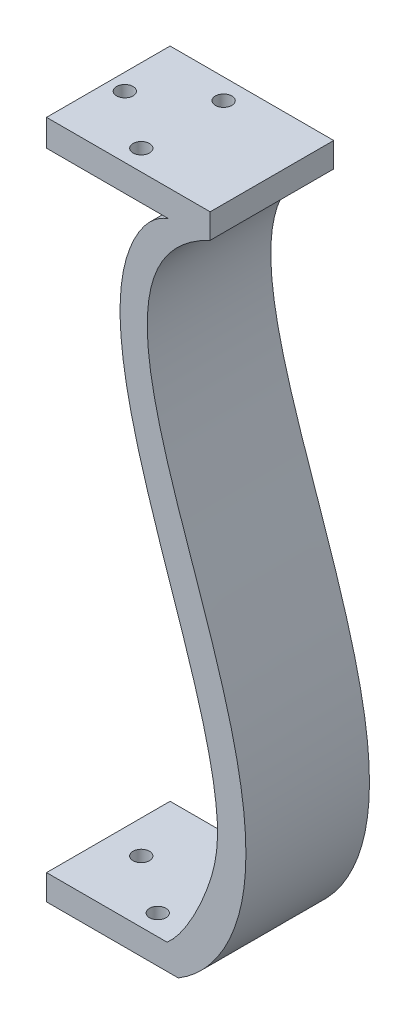
ISO-10303-21;
HEADER;
FILE_DESCRIPTION(('STEP AP214'),'2;1');
FILE_NAME('part.step','',(''),(''),'','','');
FILE_SCHEMA(('AUTOMOTIVE_DESIGN { 1 0 10303 214 1 1 1 1 }'));
ENDSEC;
DATA;
#1=APPLICATION_CONTEXT('core data for automotive mechanical design processes');
#2=APPLICATION_PROTOCOL_DEFINITION('international standard','automotive_design',2000,#1);
#3=PRODUCT_CONTEXT('',#1,'mechanical');
#4=PRODUCT('Part','Part','',(#3));
#5=PRODUCT_RELATED_PRODUCT_CATEGORY('part','',(#4));
#6=PRODUCT_DEFINITION_FORMATION('','',#4);
#7=PRODUCT_DEFINITION_CONTEXT('part definition',#1,'design');
#8=PRODUCT_DEFINITION('design','',#6,#7);
#9=PRODUCT_DEFINITION_SHAPE('','',#8);
#10=(LENGTH_UNIT() NAMED_UNIT(*) SI_UNIT(.MILLI.,.METRE.));
#11=(NAMED_UNIT(*) PLANE_ANGLE_UNIT() SI_UNIT($,.RADIAN.));
#12=(NAMED_UNIT(*) SI_UNIT($,.STERADIAN.) SOLID_ANGLE_UNIT());
#13=UNCERTAINTY_MEASURE_WITH_UNIT(LENGTH_MEASURE(1.E-05),#10,'distance_accuracy_value','');
#14=(GEOMETRIC_REPRESENTATION_CONTEXT(3) GLOBAL_UNCERTAINTY_ASSIGNED_CONTEXT((#13)) GLOBAL_UNIT_ASSIGNED_CONTEXT((#10,
#11,#12)) REPRESENTATION_CONTEXT('',''));
#15=CARTESIAN_POINT('',(0.,0.,0.));
#16=DIRECTION('',(0.,0.,1.));
#17=DIRECTION('',(1.,0.,0.));
#18=AXIS2_PLACEMENT_3D('',#15,#16,#17);
#19=CARTESIAN_POINT('',(0.,165.,-30.));
#20=DIRECTION('',(0.,0.,1.));
#21=DIRECTION('',(1.,0.,0.));
#22=AXIS2_PLACEMENT_3D('',#19,#20,#21);
#23=PLANE('',#22);
#24=DIRECTION('',(-1.,0.,0.));
#25=VECTOR('',#24,1.);
#26=CARTESIAN_POINT('',(0.,6.16560213056344,-30.));
#27=LINE('',#26,#25);
#28=CARTESIAN_POINT('',(-20.7198654493493,6.16560213056345,-30.));
#29=VERTEX_POINT('',#28);
#30=CARTESIAN_POINT('',(-50.,6.16560213056344,-30.));
#31=VERTEX_POINT('',#30);
#32=EDGE_CURVE('E59',#29,#31,#27,.T.);
#33=ORIENTED_EDGE('',*,*,#32,.F.);
#34=CARTESIAN_POINT('',(-20.7198654493493,6.16560213056345,-30.));
#35=CARTESIAN_POINT('',(-16.4171086317866,9.87986086313503,-30.));
#36=CARTESIAN_POINT('',(-8.59455584063185,25.2925313476993,-30.));
#37=CARTESIAN_POINT('',(-7.12445917762197,64.8232239319523,-30.));
#38=CARTESIAN_POINT('',(-46.2843782530998,128.92439955058,-30.));
#39=CARTESIAN_POINT('',(-24.2819890563055,157.156211749063,-30.));
#40=CARTESIAN_POINT('',(-20.3559258397296,158.5,-30.));
#41=B_SPLINE_CURVE_WITH_KNOTS('',3,(#34,#35,#36,#37,#38,#39,#40),.UNSPECIFIED.,.F.,.F.,(4,1,1,1,
4),(0.0525728869515312,0.159086781003664,0.252212072365428,0.902535386324314,1.),.UNSPECIFIED.);
#42=CARTESIAN_POINT('',(-20.3559258397296,158.5,-30.));
#43=VERTEX_POINT('',#42);
#44=EDGE_CURVE('E63',#43,#29,#41,.F.);
#45=ORIENTED_EDGE('',*,*,#44,.F.);
#46=DIRECTION('',(1.,0.,0.));
#47=VECTOR('',#46,1.);
#48=CARTESIAN_POINT('',(0.,158.5,-30.));
#49=LINE('',#48,#47);
#50=CARTESIAN_POINT('',(-50.,158.5,-30.));
#51=VERTEX_POINT('',#50);
#52=EDGE_CURVE('E221',#51,#43,#49,.T.);
#53=ORIENTED_EDGE('',*,*,#52,.F.);
#54=DIRECTION('',(0.,-1.,0.));
#55=VECTOR('',#54,1.);
#56=CARTESIAN_POINT('',(-50.,165.,-30.));
#57=LINE('',#56,#55);
#58=CARTESIAN_POINT('',(-50.,165.,-30.));
#59=VERTEX_POINT('',#58);
#60=EDGE_CURVE('E133',#59,#51,#57,.T.);
#61=ORIENTED_EDGE('',*,*,#60,.F.);
#62=DIRECTION('',(-1.,0.,0.));
#63=VECTOR('',#62,1.);
#64=CARTESIAN_POINT('',(0.,165.,-30.));
#65=LINE('',#64,#63);
#66=CARTESIAN_POINT('',(-10.2669307677797,165.,-30.));
#67=VERTEX_POINT('',#66);
#68=EDGE_CURVE('E152',#67,#59,#65,.T.);
#69=ORIENTED_EDGE('',*,*,#68,.F.);
#70=DIRECTION('',(0.,-1.,0.));
#71=VECTOR('',#70,1.);
#72=CARTESIAN_POINT('',(-10.2669307677797,159.,-30.));
#73=LINE('',#72,#71);
#74=CARTESIAN_POINT('',(-10.2669307677797,159.,-30.));
#75=VERTEX_POINT('',#74);
#76=EDGE_CURVE('E168',#67,#75,#73,.T.);
#77=ORIENTED_EDGE('',*,*,#76,.T.);
#78=CARTESIAN_POINT('',(-10.2669307677797,159.,-30.));
#79=CARTESIAN_POINT('',(-53.3339106429098,138.279185217186,-30.));
#80=CARTESIAN_POINT('',(21.0968658973275,53.2888857987779,-30.));
#81=CARTESIAN_POINT('',(-10.655091279707,4.4325375057349,-30.));
#82=CARTESIAN_POINT('',(-18.,0.,-30.));
#83=B_SPLINE_CURVE_WITH_KNOTS('',3,(#78,#79,#80,#81,#82),.UNSPECIFIED.,.F.,.F.,(4,1,4),(0.,
0.846823903806327,1.),.UNSPECIFIED.);
#84=CARTESIAN_POINT('',(-18.,0.,-30.));
#85=VERTEX_POINT('',#84);
#86=EDGE_CURVE('E174',#75,#85,#83,.T.);
#87=ORIENTED_EDGE('',*,*,#86,.T.);
#88=DIRECTION('',(-1.,0.,0.));
#89=VECTOR('',#88,1.);
#90=CARTESIAN_POINT('',(0.,0.,-30.));
#91=LINE('',#90,#89);
#92=CARTESIAN_POINT('',(-50.,0.,-30.));
#93=VERTEX_POINT('',#92);
#94=EDGE_CURVE('E156',#85,#93,#91,.T.);
#95=ORIENTED_EDGE('',*,*,#94,.T.);
#96=EDGE_CURVE('E125',#31,#93,#57,.T.);
#97=ORIENTED_EDGE('',*,*,#96,.F.);
#98=EDGE_LOOP('',(#33,#45,#53,#61,#69,#77,#87,#95,#97));
#99=FACE_BOUND('',#98,.T.);
#100=ADVANCED_FACE('F45',(#99),#23,.F.);
#101=CARTESIAN_POINT('',(-50.,165.,0.));
#102=DIRECTION('',(1.,0.,0.));
#103=DIRECTION('',(0.,0.,-1.));
#104=AXIS2_PLACEMENT_3D('',#101,#102,#103);
#105=PLANE('',#104);
#106=DIRECTION('',(0.,0.,-1.));
#107=VECTOR('',#106,1.);
#108=CARTESIAN_POINT('',(-50.,6.16560213056344,257.402973582958));
#109=LINE('',#108,#107);
#110=CARTESIAN_POINT('',(-50.,6.16560213056344,0.));
#111=VERTEX_POINT('',#110);
#112=EDGE_CURVE('E219',#111,#31,#109,.T.);
#113=ORIENTED_EDGE('',*,*,#112,.T.);
#114=ORIENTED_EDGE('',*,*,#96,.T.);
#115=DIRECTION('',(0.,0.,1.));
#116=VECTOR('',#115,1.);
#117=CARTESIAN_POINT('',(-50.,0.,0.));
#118=LINE('',#117,#116);
#119=CARTESIAN_POINT('',(-50.,0.,0.));
#120=VERTEX_POINT('',#119);
#121=EDGE_CURVE('E153',#93,#120,#118,.T.);
#122=ORIENTED_EDGE('',*,*,#121,.T.);
#123=DIRECTION('',(0.,-1.,0.));
#124=VECTOR('',#123,1.);
#125=CARTESIAN_POINT('',(-50.,165.,0.));
#126=LINE('',#125,#124);
#127=EDGE_CURVE('E126',#111,#120,#126,.T.);
#128=ORIENTED_EDGE('',*,*,#127,.F.);
#129=EDGE_LOOP('',(#113,#114,#122,#128));
#130=FACE_BOUND('',#129,.T.);
#131=ADVANCED_FACE('F210',(#130),#105,.F.);
#132=DIRECTION('',(0.,0.,-1.));
#133=VECTOR('',#132,1.);
#134=CARTESIAN_POINT('',(-50.,158.5,257.402973582958));
#135=LINE('',#134,#133);
#136=CARTESIAN_POINT('',(-50.,158.5,0.));
#137=VERTEX_POINT('',#136);
#138=EDGE_CURVE('E130',#137,#51,#135,.T.);
#139=ORIENTED_EDGE('',*,*,#138,.F.);
#140=CARTESIAN_POINT('',(-50.,165.,0.));
#141=VERTEX_POINT('',#140);
#142=EDGE_CURVE('E114',#141,#137,#126,.T.);
#143=ORIENTED_EDGE('',*,*,#142,.F.);
#144=DIRECTION('',(0.,0.,1.));
#145=VECTOR('',#144,1.);
#146=CARTESIAN_POINT('',(-50.,165.,0.));
#147=LINE('',#146,#145);
#148=EDGE_CURVE('E161',#59,#141,#147,.T.);
#149=ORIENTED_EDGE('',*,*,#148,.F.);
#150=ORIENTED_EDGE('',*,*,#60,.T.);
#151=EDGE_LOOP('',(#139,#143,#149,#150));
#152=FACE_BOUND('',#151,.T.);
#153=ADVANCED_FACE('F131',(#152),#105,.F.);
#154=CARTESIAN_POINT('',(0.,165.,0.));
#155=DIRECTION('',(0.,0.,-1.));
#156=DIRECTION('',(-1.,0.,0.));
#157=AXIS2_PLACEMENT_3D('',#154,#155,#156);
#158=PLANE('',#157);
#159=DIRECTION('',(1.,0.,0.));
#160=VECTOR('',#159,1.);
#161=CARTESIAN_POINT('',(0.,6.16560213056344,0.));
#162=LINE('',#161,#160);
#163=CARTESIAN_POINT('',(-20.7198654493493,6.16560213056345,0.));
#164=VERTEX_POINT('',#163);
#165=EDGE_CURVE('E13',#111,#164,#162,.T.);
#166=ORIENTED_EDGE('',*,*,#165,.F.);
#167=ORIENTED_EDGE('',*,*,#127,.T.);
#168=DIRECTION('',(1.,0.,0.));
#169=VECTOR('',#168,1.);
#170=CARTESIAN_POINT('',(0.,0.,0.));
#171=LINE('',#170,#169);
#172=CARTESIAN_POINT('',(-18.,0.,0.));
#173=VERTEX_POINT('',#172);
#174=EDGE_CURVE('E149',#120,#173,#171,.T.);
#175=ORIENTED_EDGE('',*,*,#174,.T.);
#176=CARTESIAN_POINT('',(-10.2669307677797,159.,0.));
#177=CARTESIAN_POINT('',(-53.3339106429098,138.279185217186,0.));
#178=CARTESIAN_POINT('',(21.0968658973275,53.2888857987779,0.));
#179=CARTESIAN_POINT('',(-10.655091279707,4.4325375057349,0.));
#180=CARTESIAN_POINT('',(-18.,0.,0.));
#181=B_SPLINE_CURVE_WITH_KNOTS('',3,(#176,#177,#178,#179,#180),.UNSPECIFIED.,.F.,.F.,(4,1,4),
(0.,0.846823903806327,1.),.UNSPECIFIED.);
#182=CARTESIAN_POINT('',(-10.2669307677797,159.,0.));
#183=VERTEX_POINT('',#182);
#184=EDGE_CURVE('E175',#183,#173,#181,.T.);
#185=ORIENTED_EDGE('',*,*,#184,.F.);
#186=DIRECTION('',(0.,-1.,0.));
#187=VECTOR('',#186,1.);
#188=CARTESIAN_POINT('',(-10.2669307677797,159.,0.));
#189=LINE('',#188,#187);
#190=CARTESIAN_POINT('',(-10.2669307677797,165.,0.));
#191=VERTEX_POINT('',#190);
#192=EDGE_CURVE('E171',#191,#183,#189,.T.);
#193=ORIENTED_EDGE('',*,*,#192,.F.);
#194=DIRECTION('',(1.,0.,0.));
#195=VECTOR('',#194,1.);
#196=CARTESIAN_POINT('',(0.,165.,0.));
#197=LINE('',#196,#195);
#198=EDGE_CURVE('E122',#141,#191,#197,.T.);
#199=ORIENTED_EDGE('',*,*,#198,.F.);
#200=ORIENTED_EDGE('',*,*,#142,.T.);
#201=DIRECTION('',(-1.,0.,0.));
#202=VECTOR('',#201,1.);
#203=CARTESIAN_POINT('',(0.,158.5,0.));
#204=LINE('',#203,#202);
#205=CARTESIAN_POINT('',(-20.3559258397296,158.5,0.));
#206=VERTEX_POINT('',#205);
#207=EDGE_CURVE('E118',#206,#137,#204,.T.);
#208=ORIENTED_EDGE('',*,*,#207,.F.);
#209=CARTESIAN_POINT('',(-20.7198654493493,6.16560213056345,0.));
#210=CARTESIAN_POINT('',(-16.4171086317866,9.87986086313503,0.));
#211=CARTESIAN_POINT('',(-8.59455584063185,25.2925313476993,0.));
#212=CARTESIAN_POINT('',(-7.12445917762197,64.8232239319523,0.));
#213=CARTESIAN_POINT('',(-46.2843782530998,128.92439955058,0.));
#214=CARTESIAN_POINT('',(-24.2819890563055,157.156211749063,0.));
#215=CARTESIAN_POINT('',(-20.3559258397296,158.5,0.));
#216=B_SPLINE_CURVE_WITH_KNOTS('',3,(#209,#210,#211,#212,#213,#214,#215),.UNSPECIFIED.,.F.,.F.,
(4,1,1,1,4),(0.0525728869515312,0.159086781003664,0.252212072365428,0.902535386324314,1.),.UNSPECIFIED.);
#217=EDGE_CURVE('E52',#164,#206,#216,.T.);
#218=ORIENTED_EDGE('',*,*,#217,.F.);
#219=EDGE_LOOP('',(#166,#167,#175,#185,#193,#199,#200,#208,#218));
#220=FACE_BOUND('',#219,.T.);
#221=ADVANCED_FACE('F116',(#220),#158,.F.);
#222=CARTESIAN_POINT('',(0.,165.,0.));
#223=DIRECTION('',(0.,1.,0.));
#224=DIRECTION('',(0.,0.,1.));
#225=AXIS2_PLACEMENT_3D('',#222,#223,#224);
#226=PLANE('',#225);
#227=CARTESIAN_POINT('',(-32.,165.,-4.99999999999999));
#228=DIRECTION('',(0.,1.,0.));
#229=DIRECTION('',(0.,0.,1.));
#230=AXIS2_PLACEMENT_3D('',#227,#228,#229);
#231=CIRCLE('',#230,2.);
#232=CARTESIAN_POINT('',(-32.,165.,-2.99999999999999));
#233=VERTEX_POINT('',#232);
#234=EDGE_CURVE('E293',#233,#233,#231,.T.);
#235=ORIENTED_EDGE('',*,*,#234,.F.);
#236=EDGE_LOOP('',(#235));
#237=FACE_BOUND('',#236,.T.);
#238=CARTESIAN_POINT('',(-32.,165.,-25.));
#239=DIRECTION('',(0.,1.,0.));
#240=DIRECTION('',(0.,0.,1.));
#241=AXIS2_PLACEMENT_3D('',#238,#239,#240);
#242=CIRCLE('',#241,2.);
#243=CARTESIAN_POINT('',(-32.,165.,-23.));
#244=VERTEX_POINT('',#243);
#245=EDGE_CURVE('E287',#244,#244,#242,.T.);
#246=ORIENTED_EDGE('',*,*,#245,.F.);
#247=EDGE_LOOP('',(#246));
#248=FACE_BOUND('',#247,.T.);
#249=CARTESIAN_POINT('',(-46.,165.,-15.));
#250=DIRECTION('',(0.,1.,0.));
#251=DIRECTION('',(0.,0.,1.));
#252=AXIS2_PLACEMENT_3D('',#249,#250,#251);
#253=CIRCLE('',#252,2.);
#254=CARTESIAN_POINT('',(-46.,165.,-13.));
#255=VERTEX_POINT('',#254);
#256=EDGE_CURVE('E280',#255,#255,#253,.T.);
#257=ORIENTED_EDGE('',*,*,#256,.F.);
#258=EDGE_LOOP('',(#257));
#259=FACE_BOUND('',#258,.T.);
#260=DIRECTION('',(0.,0.,1.));
#261=VECTOR('',#260,1.);
#262=CARTESIAN_POINT('',(-10.2669307677797,165.,-30.));
#263=LINE('',#262,#261);
#264=EDGE_CURVE('E167',#67,#191,#263,.T.);
#265=ORIENTED_EDGE('',*,*,#264,.F.);
#266=ORIENTED_EDGE('',*,*,#68,.T.);
#267=ORIENTED_EDGE('',*,*,#148,.T.);
#268=ORIENTED_EDGE('',*,*,#198,.T.);
#269=EDGE_LOOP('',(#265,#266,#267,#268));
#270=FACE_BOUND('',#269,.T.);
#271=ADVANCED_FACE('F202',(#237,#248,#259,#270),#226,.T.);
#272=CARTESIAN_POINT('',(0.,0.,0.));
#273=DIRECTION('',(0.,1.,0.));
#274=DIRECTION('',(0.,0.,1.));
#275=AXIS2_PLACEMENT_3D('',#272,#273,#274);
#276=PLANE('',#275);
#277=CARTESIAN_POINT('',(-28.,0.,-4.99999999999999));
#278=DIRECTION('',(0.,-1.,0.));
#279=DIRECTION('',(0.,0.,1.));
#280=AXIS2_PLACEMENT_3D('',#277,#278,#279);
#281=CIRCLE('',#280,2.);
#282=CARTESIAN_POINT('',(-28.,0.,-2.99999999999999));
#283=VERTEX_POINT('',#282);
#284=EDGE_CURVE('E276',#283,#283,#281,.T.);
#285=ORIENTED_EDGE('',*,*,#284,.F.);
#286=EDGE_LOOP('',(#285));
#287=FACE_BOUND('',#286,.T.);
#288=CARTESIAN_POINT('',(-28.,0.,-25.));
#289=DIRECTION('',(0.,-1.,0.));
#290=DIRECTION('',(0.,0.,-1.));
#291=AXIS2_PLACEMENT_3D('',#288,#289,#290);
#292=CIRCLE('',#291,2.);
#293=CARTESIAN_POINT('',(-28.,0.,-27.));
#294=VERTEX_POINT('',#293);
#295=EDGE_CURVE('E270',#294,#294,#292,.T.);
#296=ORIENTED_EDGE('',*,*,#295,.F.);
#297=EDGE_LOOP('',(#296));
#298=FACE_BOUND('',#297,.T.);
#299=CARTESIAN_POINT('',(-42.,0.,-15.));
#300=DIRECTION('',(0.,-1.,0.));
#301=DIRECTION('',(0.,0.,-1.));
#302=AXIS2_PLACEMENT_3D('',#299,#300,#301);
#303=CIRCLE('',#302,2.);
#304=CARTESIAN_POINT('',(-42.,0.,-17.));
#305=VERTEX_POINT('',#304);
#306=EDGE_CURVE('E237',#305,#305,#303,.T.);
#307=ORIENTED_EDGE('',*,*,#306,.F.);
#308=EDGE_LOOP('',(#307));
#309=FACE_BOUND('',#308,.T.);
#310=ORIENTED_EDGE('',*,*,#94,.F.);
#311=DIRECTION('',(0.,0.,1.));
#312=VECTOR('',#311,1.);
#313=CARTESIAN_POINT('',(-18.,0.,-30.));
#314=LINE('',#313,#312);
#315=EDGE_CURVE('E164',#85,#173,#314,.T.);
#316=ORIENTED_EDGE('',*,*,#315,.T.);
#317=ORIENTED_EDGE('',*,*,#174,.F.);
#318=ORIENTED_EDGE('',*,*,#121,.F.);
#319=EDGE_LOOP('',(#310,#316,#317,#318));
#320=FACE_BOUND('',#319,.T.);
#321=ADVANCED_FACE('F199',(#287,#298,#309,#320),#276,.F.);
#322=DIRECTION('',(0.,0.,1.));
#323=VECTOR('',#322,1.);
#324=SURFACE_OF_LINEAR_EXTRUSION('',#83,#323);
#325=ORIENTED_EDGE('',*,*,#184,.T.);
#326=ORIENTED_EDGE('',*,*,#315,.F.);
#327=ORIENTED_EDGE('',*,*,#86,.F.);
#328=DIRECTION('',(0.,0.,1.));
#329=VECTOR('',#328,1.);
#330=CARTESIAN_POINT('',(-10.2669307677797,159.,-30.));
#331=LINE('',#330,#329);
#332=EDGE_CURVE('E159',#75,#183,#331,.T.);
#333=ORIENTED_EDGE('',*,*,#332,.T.);
#334=EDGE_LOOP('',(#325,#326,#327,#333));
#335=FACE_BOUND('',#334,.T.);
#336=ADVANCED_FACE('F194',(#335),#324,.F.);
#337=CARTESIAN_POINT('',(-10.2669307677797,159.,-30.));
#338=DIRECTION('',(-1.,0.,0.));
#339=DIRECTION('',(0.,0.,1.));
#340=AXIS2_PLACEMENT_3D('',#337,#338,#339);
#341=PLANE('',#340);
#342=ORIENTED_EDGE('',*,*,#192,.T.);
#343=ORIENTED_EDGE('',*,*,#332,.F.);
#344=ORIENTED_EDGE('',*,*,#76,.F.);
#345=ORIENTED_EDGE('',*,*,#264,.T.);
#346=EDGE_LOOP('',(#342,#343,#344,#345));
#347=FACE_BOUND('',#346,.T.);
#348=ADVANCED_FACE('F198',(#347),#341,.F.);
#349=CARTESIAN_POINT('',(-20.7198654493493,6.16560213056345,257.402973582958));
#350=DIRECTION('',(0.,1.,0.));
#351=DIRECTION('',(-1.,0.,0.));
#352=AXIS2_PLACEMENT_3D('',#349,#350,#351);
#353=PLANE('',#352);
#354=CARTESIAN_POINT('',(-28.,6.16560213056344,-4.99999999999999));
#355=DIRECTION('',(0.,1.,0.));
#356=DIRECTION('',(-1.,0.,0.));
#357=AXIS2_PLACEMENT_3D('',#354,#355,#356);
#358=CIRCLE('',#357,2.);
#359=CARTESIAN_POINT('',(-30.,6.16560213056344,-4.99999999999999));
#360=VERTEX_POINT('',#359);
#361=EDGE_CURVE('E261',#360,#360,#358,.F.);
#362=ORIENTED_EDGE('',*,*,#361,.T.);
#363=EDGE_LOOP('',(#362));
#364=FACE_BOUND('',#363,.T.);
#365=CARTESIAN_POINT('',(-28.,6.16560213056344,-25.));
#366=DIRECTION('',(0.,1.,0.));
#367=DIRECTION('',(-1.,0.,0.));
#368=AXIS2_PLACEMENT_3D('',#365,#366,#367);
#369=CIRCLE('',#368,2.);
#370=CARTESIAN_POINT('',(-30.,6.16560213056344,-25.));
#371=VERTEX_POINT('',#370);
#372=EDGE_CURVE('E265',#371,#371,#369,.F.);
#373=ORIENTED_EDGE('',*,*,#372,.T.);
#374=EDGE_LOOP('',(#373));
#375=FACE_BOUND('',#374,.T.);
#376=CARTESIAN_POINT('',(-42.,6.16560213056344,-15.));
#377=DIRECTION('',(0.,1.,0.));
#378=DIRECTION('',(-1.,0.,0.));
#379=AXIS2_PLACEMENT_3D('',#376,#377,#378);
#380=CIRCLE('',#379,2.);
#381=CARTESIAN_POINT('',(-44.,6.16560213056344,-15.));
#382=VERTEX_POINT('',#381);
#383=EDGE_CURVE('E268',#382,#382,#380,.F.);
#384=ORIENTED_EDGE('',*,*,#383,.T.);
#385=EDGE_LOOP('',(#384));
#386=FACE_BOUND('',#385,.T.);
#387=DIRECTION('',(0.,0.,-1.));
#388=VECTOR('',#387,1.);
#389=CARTESIAN_POINT('',(-20.7198654493493,6.16560213056345,257.402973582958));
#390=LINE('',#389,#388);
#391=EDGE_CURVE('E135',#164,#29,#390,.T.);
#392=ORIENTED_EDGE('',*,*,#391,.T.);
#393=ORIENTED_EDGE('',*,*,#32,.T.);
#394=ORIENTED_EDGE('',*,*,#112,.F.);
#395=ORIENTED_EDGE('',*,*,#165,.T.);
#396=EDGE_LOOP('',(#392,#393,#394,#395));
#397=FACE_BOUND('',#396,.T.);
#398=ADVANCED_FACE('F226',(#364,#375,#386,#397),#353,.T.);
#399=CARTESIAN_POINT('',(-20.7198654493493,6.16560213056345,257.402973582958));
#400=CARTESIAN_POINT('',(-16.4171086317866,9.87986086313503,257.402973582958));
#401=CARTESIAN_POINT('',(-8.59455584063185,25.2925313476993,257.402973582958));
#402=CARTESIAN_POINT('',(-7.12445917762197,64.8232239319523,257.402973582958));
#403=CARTESIAN_POINT('',(-46.2843782530998,128.92439955058,257.402973582958));
#404=CARTESIAN_POINT('',(-24.2819890563055,157.156211749063,257.402973582958));
#405=CARTESIAN_POINT('',(-20.3559258397296,158.5,257.402973582958));
#406=B_SPLINE_CURVE_WITH_KNOTS('',3,(#399,#400,#401,#402,#403,#404,#405),.UNSPECIFIED.,.F.,.F.,
(4,1,1,1,4),(0.0525728869515312,0.159086781003664,0.252212072365428,0.902535386324314,1.),.UNSPECIFIED.);
#407=DIRECTION('',(0.,0.,-1.));
#408=VECTOR('',#407,1.);
#409=SURFACE_OF_LINEAR_EXTRUSION('',#406,#408);
#410=DIRECTION('',(0.,0.,-1.));
#411=VECTOR('',#410,1.);
#412=CARTESIAN_POINT('',(-20.3559258397296,158.5,257.402973582958));
#413=LINE('',#412,#411);
#414=EDGE_CURVE('E136',#206,#43,#413,.T.);
#415=ORIENTED_EDGE('',*,*,#414,.T.);
#416=ORIENTED_EDGE('',*,*,#44,.T.);
#417=ORIENTED_EDGE('',*,*,#391,.F.);
#418=ORIENTED_EDGE('',*,*,#217,.T.);
#419=EDGE_LOOP('',(#415,#416,#417,#418));
#420=FACE_BOUND('',#419,.T.);
#421=ADVANCED_FACE('F248',(#420),#409,.T.);
#422=CARTESIAN_POINT('',(-20.3559258397297,158.5,257.402973582958));
#423=DIRECTION('',(0.,-1.,0.));
#424=DIRECTION('',(0.,0.,-1.));
#425=AXIS2_PLACEMENT_3D('',#422,#423,#424);
#426=PLANE('',#425);
#427=CARTESIAN_POINT('',(-32.,158.5,-4.99999999999999));
#428=DIRECTION('',(0.,-1.,0.));
#429=DIRECTION('',(0.,0.,-1.));
#430=AXIS2_PLACEMENT_3D('',#427,#428,#429);
#431=CIRCLE('',#430,2.);
#432=CARTESIAN_POINT('',(-32.,158.5,-7.));
#433=VERTEX_POINT('',#432);
#434=EDGE_CURVE('E290',#433,#433,#431,.F.);
#435=ORIENTED_EDGE('',*,*,#434,.T.);
#436=EDGE_LOOP('',(#435));
#437=FACE_BOUND('',#436,.T.);
#438=CARTESIAN_POINT('',(-32.,158.5,-25.));
#439=DIRECTION('',(0.,-1.,0.));
#440=DIRECTION('',(0.,0.,-1.));
#441=AXIS2_PLACEMENT_3D('',#438,#439,#440);
#442=CIRCLE('',#441,2.);
#443=CARTESIAN_POINT('',(-32.,158.5,-27.));
#444=VERTEX_POINT('',#443);
#445=EDGE_CURVE('E284',#444,#444,#442,.F.);
#446=ORIENTED_EDGE('',*,*,#445,.T.);
#447=EDGE_LOOP('',(#446));
#448=FACE_BOUND('',#447,.T.);
#449=CARTESIAN_POINT('',(-46.,158.5,-15.));
#450=DIRECTION('',(0.,-1.,0.));
#451=DIRECTION('',(0.,0.,-1.));
#452=AXIS2_PLACEMENT_3D('',#449,#450,#451);
#453=CIRCLE('',#452,2.);
#454=CARTESIAN_POINT('',(-46.,158.5,-17.));
#455=VERTEX_POINT('',#454);
#456=EDGE_CURVE('E281',#455,#455,#453,.F.);
#457=ORIENTED_EDGE('',*,*,#456,.T.);
#458=EDGE_LOOP('',(#457));
#459=FACE_BOUND('',#458,.T.);
#460=ORIENTED_EDGE('',*,*,#138,.T.);
#461=ORIENTED_EDGE('',*,*,#52,.T.);
#462=ORIENTED_EDGE('',*,*,#414,.F.);
#463=ORIENTED_EDGE('',*,*,#207,.T.);
#464=EDGE_LOOP('',(#460,#461,#462,#463));
#465=FACE_BOUND('',#464,.T.);
#466=ADVANCED_FACE('F139',(#437,#448,#459,#465),#426,.T.);
#467=CARTESIAN_POINT('',(-42.,165.001,-15.));
#468=DIRECTION('',(0.,-1.,0.));
#469=DIRECTION('',(0.,0.,-1.));
#470=AXIS2_PLACEMENT_3D('',#467,#468,#469);
#471=CYLINDRICAL_SURFACE('',#470,2.);
#472=ORIENTED_EDGE('',*,*,#383,.F.);
#473=EDGE_LOOP('',(#472));
#474=FACE_BOUND('',#473,.T.);
#475=ORIENTED_EDGE('',*,*,#306,.T.);
#476=EDGE_LOOP('',(#475));
#477=FACE_BOUND('',#476,.T.);
#478=ADVANCED_FACE('F336',(#474,#477),#471,.F.);
#479=CARTESIAN_POINT('',(-28.,165.001,-25.));
#480=DIRECTION('',(0.,-1.,0.));
#481=DIRECTION('',(0.,0.,-1.));
#482=AXIS2_PLACEMENT_3D('',#479,#480,#481);
#483=CYLINDRICAL_SURFACE('',#482,2.);
#484=ORIENTED_EDGE('',*,*,#372,.F.);
#485=EDGE_LOOP('',(#484));
#486=FACE_BOUND('',#485,.T.);
#487=ORIENTED_EDGE('',*,*,#295,.T.);
#488=EDGE_LOOP('',(#487));
#489=FACE_BOUND('',#488,.T.);
#490=ADVANCED_FACE('F330',(#486,#489),#483,.F.);
#491=CARTESIAN_POINT('',(-28.,165.001,-4.99999999999999));
#492=DIRECTION('',(0.,-1.,0.));
#493=DIRECTION('',(0.,0.,-1.));
#494=AXIS2_PLACEMENT_3D('',#491,#492,#493);
#495=CYLINDRICAL_SURFACE('',#494,2.);
#496=ORIENTED_EDGE('',*,*,#361,.F.);
#497=EDGE_LOOP('',(#496));
#498=FACE_BOUND('',#497,.T.);
#499=ORIENTED_EDGE('',*,*,#284,.T.);
#500=EDGE_LOOP('',(#499));
#501=FACE_BOUND('',#500,.T.);
#502=ADVANCED_FACE('F321',(#498,#501),#495,.F.);
#503=CARTESIAN_POINT('',(-46.,-0.001000000000001,-15.));
#504=DIRECTION('',(0.,1.,0.));
#505=DIRECTION('',(0.,0.,1.));
#506=AXIS2_PLACEMENT_3D('',#503,#504,#505);
#507=CYLINDRICAL_SURFACE('',#506,2.);
#508=ORIENTED_EDGE('',*,*,#456,.F.);
#509=EDGE_LOOP('',(#508));
#510=FACE_BOUND('',#509,.T.);
#511=ORIENTED_EDGE('',*,*,#256,.T.);
#512=EDGE_LOOP('',(#511));
#513=FACE_BOUND('',#512,.T.);
#514=ADVANCED_FACE('F319',(#510,#513),#507,.F.);
#515=CARTESIAN_POINT('',(-32.,-0.001000000000001,-25.));
#516=DIRECTION('',(0.,1.,0.));
#517=DIRECTION('',(0.,0.,1.));
#518=AXIS2_PLACEMENT_3D('',#515,#516,#517);
#519=CYLINDRICAL_SURFACE('',#518,2.);
#520=ORIENTED_EDGE('',*,*,#445,.F.);
#521=EDGE_LOOP('',(#520));
#522=FACE_BOUND('',#521,.T.);
#523=ORIENTED_EDGE('',*,*,#245,.T.);
#524=EDGE_LOOP('',(#523));
#525=FACE_BOUND('',#524,.T.);
#526=ADVANCED_FACE('F304',(#522,#525),#519,.F.);
#527=CARTESIAN_POINT('',(-32.,-0.001000000000001,-4.99999999999999));
#528=DIRECTION('',(0.,1.,0.));
#529=DIRECTION('',(0.,0.,1.));
#530=AXIS2_PLACEMENT_3D('',#527,#528,#529);
#531=CYLINDRICAL_SURFACE('',#530,2.);
#532=ORIENTED_EDGE('',*,*,#434,.F.);
#533=EDGE_LOOP('',(#532));
#534=FACE_BOUND('',#533,.T.);
#535=ORIENTED_EDGE('',*,*,#234,.T.);
#536=EDGE_LOOP('',(#535));
#537=FACE_BOUND('',#536,.T.);
#538=ADVANCED_FACE('F301',(#534,#537),#531,.F.);
#539=CLOSED_SHELL('',(#100,#131,#153,#221,#271,#321,#336,#348,#398,#421,#466,#478,#490,#502,
#514,#526,#538));
#540=MANIFOLD_SOLID_BREP('B2',#539);
#541=ADVANCED_BREP_SHAPE_REPRESENTATION('',(#18,#540),#14);
#542=SHAPE_DEFINITION_REPRESENTATION(#9,#541);
ENDSEC;
END-ISO-10303-21;
